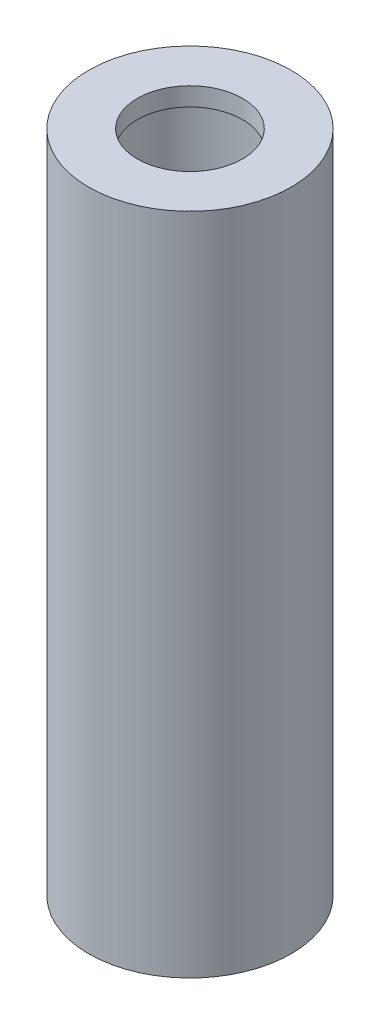
ISO-10303-21;
HEADER;
FILE_DESCRIPTION(('STEP AP214'),'2;1');
FILE_NAME('part.step','',(''),(''),'','','');
FILE_SCHEMA(('AUTOMOTIVE_DESIGN { 1 0 10303 214 1 1 1 1 }'));
ENDSEC;
DATA;
#1=APPLICATION_CONTEXT('core data for automotive mechanical design processes');
#2=APPLICATION_PROTOCOL_DEFINITION('international standard','automotive_design',2000,#1);
#3=PRODUCT_CONTEXT('',#1,'mechanical');
#4=PRODUCT('Part','Part','',(#3));
#5=PRODUCT_RELATED_PRODUCT_CATEGORY('part','',(#4));
#6=PRODUCT_DEFINITION_FORMATION('','',#4);
#7=PRODUCT_DEFINITION_CONTEXT('part definition',#1,'design');
#8=PRODUCT_DEFINITION('design','',#6,#7);
#9=PRODUCT_DEFINITION_SHAPE('','',#8);
#10=(LENGTH_UNIT() NAMED_UNIT(*) SI_UNIT(.MILLI.,.METRE.));
#11=(NAMED_UNIT(*) PLANE_ANGLE_UNIT() SI_UNIT($,.RADIAN.));
#12=(NAMED_UNIT(*) SI_UNIT($,.STERADIAN.) SOLID_ANGLE_UNIT());
#13=UNCERTAINTY_MEASURE_WITH_UNIT(LENGTH_MEASURE(1.E-05),#10,'distance_accuracy_value','');
#14=(GEOMETRIC_REPRESENTATION_CONTEXT(3) GLOBAL_UNCERTAINTY_ASSIGNED_CONTEXT((#13)) GLOBAL_UNIT_ASSIGNED_CONTEXT((#10,
#11,#12)) REPRESENTATION_CONTEXT('',''));
#15=CARTESIAN_POINT('',(0.,0.,0.));
#16=DIRECTION('',(0.,0.,1.));
#17=DIRECTION('',(1.,0.,0.));
#18=AXIS2_PLACEMENT_3D('',#15,#16,#17);
#19=CARTESIAN_POINT('',(0.,25.25,0.));
#20=DIRECTION('',(0.,-1.,0.));
#21=DIRECTION('',(0.,0.,-1.));
#22=AXIS2_PLACEMENT_3D('',#19,#20,#21);
#23=CYLINDRICAL_SURFACE('',#22,2.6);
#24=CARTESIAN_POINT('',(0.,0.,0.));
#25=DIRECTION('',(0.,1.,0.));
#26=DIRECTION('',(0.,0.,1.));
#27=AXIS2_PLACEMENT_3D('',#24,#25,#26);
#28=CIRCLE('',#27,2.6);
#29=CARTESIAN_POINT('',(0.,0.,2.6));
#30=VERTEX_POINT('',#29);
#31=EDGE_CURVE('E52',#30,#30,#28,.T.);
#32=ORIENTED_EDGE('',*,*,#31,.F.);
#33=EDGE_LOOP('',(#32));
#34=FACE_BOUND('',#33,.T.);
#35=CARTESIAN_POINT('',(0.,24.55,0.));
#36=DIRECTION('',(0.,1.,0.));
#37=DIRECTION('',(0.,0.,1.));
#38=AXIS2_PLACEMENT_3D('',#35,#36,#37);
#39=CIRCLE('',#38,2.6);
#40=CARTESIAN_POINT('',(0.,24.55,2.6));
#41=VERTEX_POINT('',#40);
#42=EDGE_CURVE('E41',#41,#41,#39,.T.);
#43=ORIENTED_EDGE('',*,*,#42,.T.);
#44=EDGE_LOOP('',(#43));
#45=FACE_BOUND('',#44,.T.);
#46=ADVANCED_FACE('F37',(#34,#45),#23,.F.);
#47=CARTESIAN_POINT('',(0.,25.25,0.));
#48=DIRECTION('',(0.,1.,0.));
#49=DIRECTION('',(0.,0.,1.));
#50=AXIS2_PLACEMENT_3D('',#47,#48,#49);
#51=PLANE('',#50);
#52=CARTESIAN_POINT('',(0.,25.25,0.));
#53=DIRECTION('',(0.,1.,0.));
#54=DIRECTION('',(0.,0.,1.));
#55=AXIS2_PLACEMENT_3D('',#52,#53,#54);
#56=CIRCLE('',#55,3.85);
#57=CARTESIAN_POINT('',(0.,25.25,3.85));
#58=VERTEX_POINT('',#57);
#59=EDGE_CURVE('E10',#58,#58,#56,.T.);
#60=ORIENTED_EDGE('',*,*,#59,.T.);
#61=EDGE_LOOP('',(#60));
#62=FACE_BOUND('',#61,.T.);
#63=CARTESIAN_POINT('',(0.,25.25,0.));
#64=DIRECTION('',(0.,1.,0.));
#65=DIRECTION('',(0.,0.,1.));
#66=AXIS2_PLACEMENT_3D('',#63,#64,#65);
#67=CIRCLE('',#66,2.);
#68=CARTESIAN_POINT('',(0.,25.25,2.));
#69=VERTEX_POINT('',#68);
#70=EDGE_CURVE('E57',#69,#69,#67,.T.);
#71=ORIENTED_EDGE('',*,*,#70,.F.);
#72=EDGE_LOOP('',(#71));
#73=FACE_BOUND('',#72,.T.);
#74=ADVANCED_FACE('F85',(#62,#73),#51,.T.);
#75=CARTESIAN_POINT('',(0.,0.,0.));
#76=DIRECTION('',(0.,1.,0.));
#77=DIRECTION('',(0.,0.,1.));
#78=AXIS2_PLACEMENT_3D('',#75,#76,#77);
#79=PLANE('',#78);
#80=CARTESIAN_POINT('',(0.,0.,0.));
#81=DIRECTION('',(0.,1.,0.));
#82=DIRECTION('',(0.,0.,1.));
#83=AXIS2_PLACEMENT_3D('',#80,#81,#82);
#84=CIRCLE('',#83,3.85);
#85=CARTESIAN_POINT('',(0.,0.,3.85));
#86=VERTEX_POINT('',#85);
#87=EDGE_CURVE('E46',#86,#86,#84,.T.);
#88=ORIENTED_EDGE('',*,*,#87,.F.);
#89=EDGE_LOOP('',(#88));
#90=FACE_BOUND('',#89,.T.);
#91=ORIENTED_EDGE('',*,*,#31,.T.);
#92=EDGE_LOOP('',(#91));
#93=FACE_BOUND('',#92,.T.);
#94=ADVANCED_FACE('F81',(#90,#93),#79,.F.);
#95=CARTESIAN_POINT('',(0.,25.25,0.));
#96=DIRECTION('',(0.,-1.,0.));
#97=DIRECTION('',(0.,0.,-1.));
#98=AXIS2_PLACEMENT_3D('',#95,#96,#97);
#99=CYLINDRICAL_SURFACE('',#98,3.85);
#100=ORIENTED_EDGE('',*,*,#59,.F.);
#101=EDGE_LOOP('',(#100));
#102=FACE_BOUND('',#101,.T.);
#103=ORIENTED_EDGE('',*,*,#87,.T.);
#104=EDGE_LOOP('',(#103));
#105=FACE_BOUND('',#104,.T.);
#106=ADVANCED_FACE('F39',(#102,#105),#99,.T.);
#107=CARTESIAN_POINT('',(0.,24.55,0.));
#108=DIRECTION('',(0.,1.,0.));
#109=DIRECTION('',(0.,0.,1.));
#110=AXIS2_PLACEMENT_3D('',#107,#108,#109);
#111=PLANE('',#110);
#112=CARTESIAN_POINT('',(0.,24.55,0.));
#113=DIRECTION('',(0.,1.,0.));
#114=DIRECTION('',(0.,0.,1.));
#115=AXIS2_PLACEMENT_3D('',#112,#113,#114);
#116=CIRCLE('',#115,2.);
#117=CARTESIAN_POINT('',(0.,24.55,2.));
#118=VERTEX_POINT('',#117);
#119=EDGE_CURVE('E61',#118,#118,#116,.T.);
#120=ORIENTED_EDGE('',*,*,#119,.T.);
#121=EDGE_LOOP('',(#120));
#122=FACE_BOUND('',#121,.T.);
#123=ORIENTED_EDGE('',*,*,#42,.F.);
#124=EDGE_LOOP('',(#123));
#125=FACE_BOUND('',#124,.T.);
#126=ADVANCED_FACE('F71',(#122,#125),#111,.F.);
#127=CARTESIAN_POINT('',(0.,24.55,0.));
#128=DIRECTION('',(0.,1.,0.));
#129=DIRECTION('',(0.,0.,1.));
#130=AXIS2_PLACEMENT_3D('',#127,#128,#129);
#131=CYLINDRICAL_SURFACE('',#130,2.);
#132=ORIENTED_EDGE('',*,*,#119,.F.);
#133=EDGE_LOOP('',(#132));
#134=FACE_BOUND('',#133,.T.);
#135=ORIENTED_EDGE('',*,*,#70,.T.);
#136=EDGE_LOOP('',(#135));
#137=FACE_BOUND('',#136,.T.);
#138=ADVANCED_FACE('F73',(#134,#137),#131,.F.);
#139=CLOSED_SHELL('',(#46,#74,#94,#106,#126,#138));
#140=MANIFOLD_SOLID_BREP('B2',#139);
#141=ADVANCED_BREP_SHAPE_REPRESENTATION('',(#18,#140),#14);
#142=SHAPE_DEFINITION_REPRESENTATION(#9,#141);
ENDSEC;
END-ISO-10303-21;
